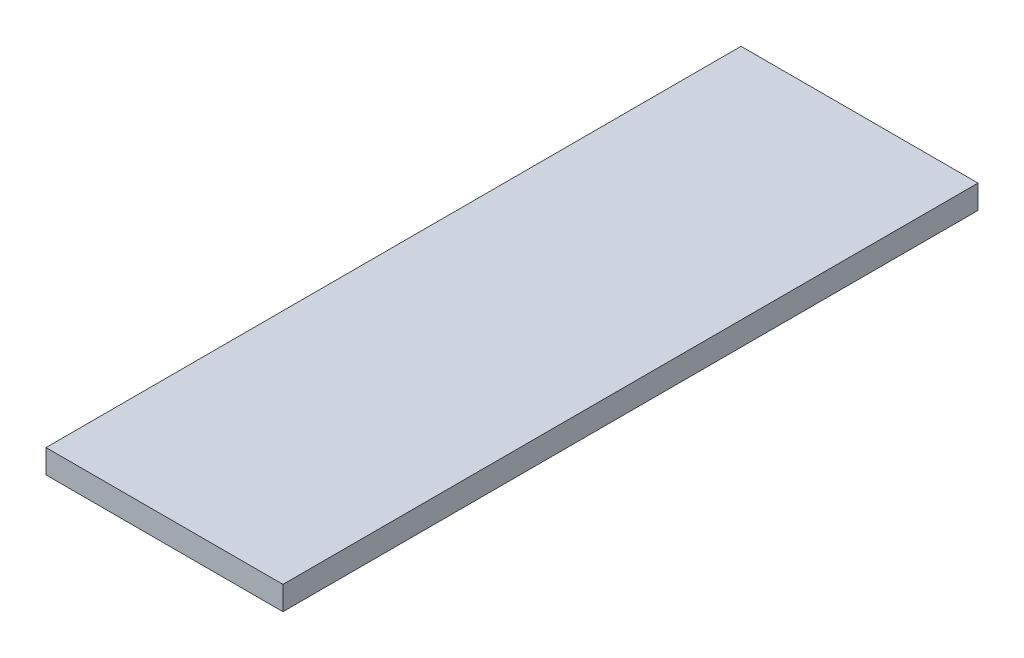
ISO-10303-21;
HEADER;
FILE_DESCRIPTION(('STEP AP214'),'2;1');
FILE_NAME('part.step','',(''),(''),'','','');
FILE_SCHEMA(('AUTOMOTIVE_DESIGN { 1 0 10303 214 1 1 1 1 }'));
ENDSEC;
DATA;
#1=APPLICATION_CONTEXT('core data for automotive mechanical design processes');
#2=APPLICATION_PROTOCOL_DEFINITION('international standard','automotive_design',2000,#1);
#3=PRODUCT_CONTEXT('',#1,'mechanical');
#4=PRODUCT('Part','Part','',(#3));
#5=PRODUCT_RELATED_PRODUCT_CATEGORY('part','',(#4));
#6=PRODUCT_DEFINITION_FORMATION('','',#4);
#7=PRODUCT_DEFINITION_CONTEXT('part definition',#1,'design');
#8=PRODUCT_DEFINITION('design','',#6,#7);
#9=PRODUCT_DEFINITION_SHAPE('','',#8);
#10=(LENGTH_UNIT() NAMED_UNIT(*) SI_UNIT(.MILLI.,.METRE.));
#11=(NAMED_UNIT(*) PLANE_ANGLE_UNIT() SI_UNIT($,.RADIAN.));
#12=(NAMED_UNIT(*) SI_UNIT($,.STERADIAN.) SOLID_ANGLE_UNIT());
#13=UNCERTAINTY_MEASURE_WITH_UNIT(LENGTH_MEASURE(1.E-05),#10,'distance_accuracy_value','');
#14=(GEOMETRIC_REPRESENTATION_CONTEXT(3) GLOBAL_UNCERTAINTY_ASSIGNED_CONTEXT((#13)) GLOBAL_UNIT_ASSIGNED_CONTEXT((#10,
#11,#12)) REPRESENTATION_CONTEXT('',''));
#15=CARTESIAN_POINT('',(0.,0.,0.));
#16=DIRECTION('',(0.,0.,1.));
#17=DIRECTION('',(1.,0.,0.));
#18=AXIS2_PLACEMENT_3D('',#15,#16,#17);
#19=CARTESIAN_POINT('',(0.,3.,0.));
#20=DIRECTION('',(1.,0.,0.));
#21=DIRECTION('',(0.,0.,-1.));
#22=AXIS2_PLACEMENT_3D('',#19,#20,#21);
#23=PLANE('',#22);
#24=DIRECTION('',(0.,0.,1.));
#25=VECTOR('',#24,1.);
#26=CARTESIAN_POINT('',(0.,0.,0.));
#27=LINE('',#26,#25);
#28=CARTESIAN_POINT('',(0.,0.,-88.));
#29=VERTEX_POINT('',#28);
#30=CARTESIAN_POINT('',(0.,0.,0.));
#31=VERTEX_POINT('',#30);
#32=EDGE_CURVE('E107',#29,#31,#27,.T.);
#33=ORIENTED_EDGE('',*,*,#32,.T.);
#34=DIRECTION('',(0.,-1.,0.));
#35=VECTOR('',#34,1.);
#36=CARTESIAN_POINT('',(0.,3.,0.));
#37=LINE('',#36,#35);
#38=CARTESIAN_POINT('',(0.,3.,0.));
#39=VERTEX_POINT('',#38);
#40=EDGE_CURVE('E11',#39,#31,#37,.T.);
#41=ORIENTED_EDGE('',*,*,#40,.F.);
#42=DIRECTION('',(0.,0.,1.));
#43=VECTOR('',#42,1.);
#44=CARTESIAN_POINT('',(0.,3.,0.));
#45=LINE('',#44,#43);
#46=CARTESIAN_POINT('',(0.,3.,-88.));
#47=VERTEX_POINT('',#46);
#48=EDGE_CURVE('E91',#47,#39,#45,.T.);
#49=ORIENTED_EDGE('',*,*,#48,.F.);
#50=DIRECTION('',(0.,-1.,0.));
#51=VECTOR('',#50,1.);
#52=CARTESIAN_POINT('',(0.,3.,-88.));
#53=LINE('',#52,#51);
#54=EDGE_CURVE('E103',#47,#29,#53,.T.);
#55=ORIENTED_EDGE('',*,*,#54,.T.);
#56=EDGE_LOOP('',(#33,#41,#49,#55));
#57=FACE_BOUND('',#56,.T.);
#58=ADVANCED_FACE('F39',(#57),#23,.F.);
#59=CARTESIAN_POINT('',(0.,3.,0.));
#60=DIRECTION('',(0.,0.,-1.));
#61=DIRECTION('',(-1.,0.,0.));
#62=AXIS2_PLACEMENT_3D('',#59,#60,#61);
#63=PLANE('',#62);
#64=DIRECTION('',(1.,0.,0.));
#65=VECTOR('',#64,1.);
#66=CARTESIAN_POINT('',(0.,0.,0.));
#67=LINE('',#66,#65);
#68=CARTESIAN_POINT('',(30.,0.,0.));
#69=VERTEX_POINT('',#68);
#70=EDGE_CURVE('E96',#31,#69,#67,.T.);
#71=ORIENTED_EDGE('',*,*,#70,.T.);
#72=DIRECTION('',(0.,-1.,0.));
#73=VECTOR('',#72,1.);
#74=CARTESIAN_POINT('',(30.,3.,0.));
#75=LINE('',#74,#73);
#76=CARTESIAN_POINT('',(30.,3.,0.));
#77=VERTEX_POINT('',#76);
#78=EDGE_CURVE('E47',#77,#69,#75,.T.);
#79=ORIENTED_EDGE('',*,*,#78,.F.);
#80=DIRECTION('',(1.,0.,0.));
#81=VECTOR('',#80,1.);
#82=CARTESIAN_POINT('',(0.,3.,0.));
#83=LINE('',#82,#81);
#84=EDGE_CURVE('E86',#39,#77,#83,.T.);
#85=ORIENTED_EDGE('',*,*,#84,.F.);
#86=ORIENTED_EDGE('',*,*,#40,.T.);
#87=EDGE_LOOP('',(#71,#79,#85,#86));
#88=FACE_BOUND('',#87,.T.);
#89=ADVANCED_FACE('F95',(#88),#63,.F.);
#90=CARTESIAN_POINT('',(30.,3.,0.));
#91=DIRECTION('',(-1.,0.,0.));
#92=DIRECTION('',(0.,0.,1.));
#93=AXIS2_PLACEMENT_3D('',#90,#91,#92);
#94=PLANE('',#93);
#95=DIRECTION('',(0.,0.,-1.));
#96=VECTOR('',#95,1.);
#97=CARTESIAN_POINT('',(30.,0.,0.));
#98=LINE('',#97,#96);
#99=CARTESIAN_POINT('',(30.,0.,-88.));
#100=VERTEX_POINT('',#99);
#101=EDGE_CURVE('E72',#69,#100,#98,.T.);
#102=ORIENTED_EDGE('',*,*,#101,.T.);
#103=DIRECTION('',(0.,-1.,0.));
#104=VECTOR('',#103,1.);
#105=CARTESIAN_POINT('',(30.,3.,-88.));
#106=LINE('',#105,#104);
#107=CARTESIAN_POINT('',(30.,3.,-88.));
#108=VERTEX_POINT('',#107);
#109=EDGE_CURVE('E97',#108,#100,#106,.T.);
#110=ORIENTED_EDGE('',*,*,#109,.F.);
#111=DIRECTION('',(0.,0.,-1.));
#112=VECTOR('',#111,1.);
#113=CARTESIAN_POINT('',(30.,3.,0.));
#114=LINE('',#113,#112);
#115=EDGE_CURVE('E89',#77,#108,#114,.T.);
#116=ORIENTED_EDGE('',*,*,#115,.F.);
#117=ORIENTED_EDGE('',*,*,#78,.T.);
#118=EDGE_LOOP('',(#102,#110,#116,#117));
#119=FACE_BOUND('',#118,.T.);
#120=ADVANCED_FACE('F98',(#119),#94,.F.);
#121=CARTESIAN_POINT('',(0.,3.,-88.));
#122=DIRECTION('',(0.,0.,1.));
#123=DIRECTION('',(1.,0.,0.));
#124=AXIS2_PLACEMENT_3D('',#121,#122,#123);
#125=PLANE('',#124);
#126=DIRECTION('',(-1.,0.,0.));
#127=VECTOR('',#126,1.);
#128=CARTESIAN_POINT('',(0.,0.,-88.));
#129=LINE('',#128,#127);
#130=EDGE_CURVE('E79',#100,#29,#129,.T.);
#131=ORIENTED_EDGE('',*,*,#130,.T.);
#132=ORIENTED_EDGE('',*,*,#54,.F.);
#133=DIRECTION('',(-1.,0.,0.));
#134=VECTOR('',#133,1.);
#135=CARTESIAN_POINT('',(0.,3.,-88.));
#136=LINE('',#135,#134);
#137=EDGE_CURVE('E55',#108,#47,#136,.T.);
#138=ORIENTED_EDGE('',*,*,#137,.F.);
#139=ORIENTED_EDGE('',*,*,#109,.T.);
#140=EDGE_LOOP('',(#131,#132,#138,#139));
#141=FACE_BOUND('',#140,.T.);
#142=ADVANCED_FACE('F117',(#141),#125,.F.);
#143=CARTESIAN_POINT('',(0.,3.,0.));
#144=DIRECTION('',(0.,-1.,0.));
#145=DIRECTION('',(0.,0.,-1.));
#146=AXIS2_PLACEMENT_3D('',#143,#144,#145);
#147=PLANE('',#146);
#148=ORIENTED_EDGE('',*,*,#48,.T.);
#149=ORIENTED_EDGE('',*,*,#84,.T.);
#150=ORIENTED_EDGE('',*,*,#115,.T.);
#151=ORIENTED_EDGE('',*,*,#137,.T.);
#152=EDGE_LOOP('',(#148,#149,#150,#151));
#153=FACE_BOUND('',#152,.T.);
#154=ADVANCED_FACE('F87',(#153),#147,.F.);
#155=CARTESIAN_POINT('',(0.,0.,0.));
#156=DIRECTION('',(0.,-1.,0.));
#157=DIRECTION('',(0.,0.,-1.));
#158=AXIS2_PLACEMENT_3D('',#155,#156,#157);
#159=PLANE('',#158);
#160=ORIENTED_EDGE('',*,*,#32,.F.);
#161=ORIENTED_EDGE('',*,*,#130,.F.);
#162=ORIENTED_EDGE('',*,*,#101,.F.);
#163=ORIENTED_EDGE('',*,*,#70,.F.);
#164=EDGE_LOOP('',(#160,#161,#162,#163));
#165=FACE_BOUND('',#164,.T.);
#166=ADVANCED_FACE('F120',(#165),#159,.T.);
#167=CLOSED_SHELL('',(#58,#89,#120,#142,#154,#166));
#168=MANIFOLD_SOLID_BREP('B2',#167);
#169=ADVANCED_BREP_SHAPE_REPRESENTATION('',(#18,#168),#14);
#170=SHAPE_DEFINITION_REPRESENTATION(#9,#169);
ENDSEC;
END-ISO-10303-21;
